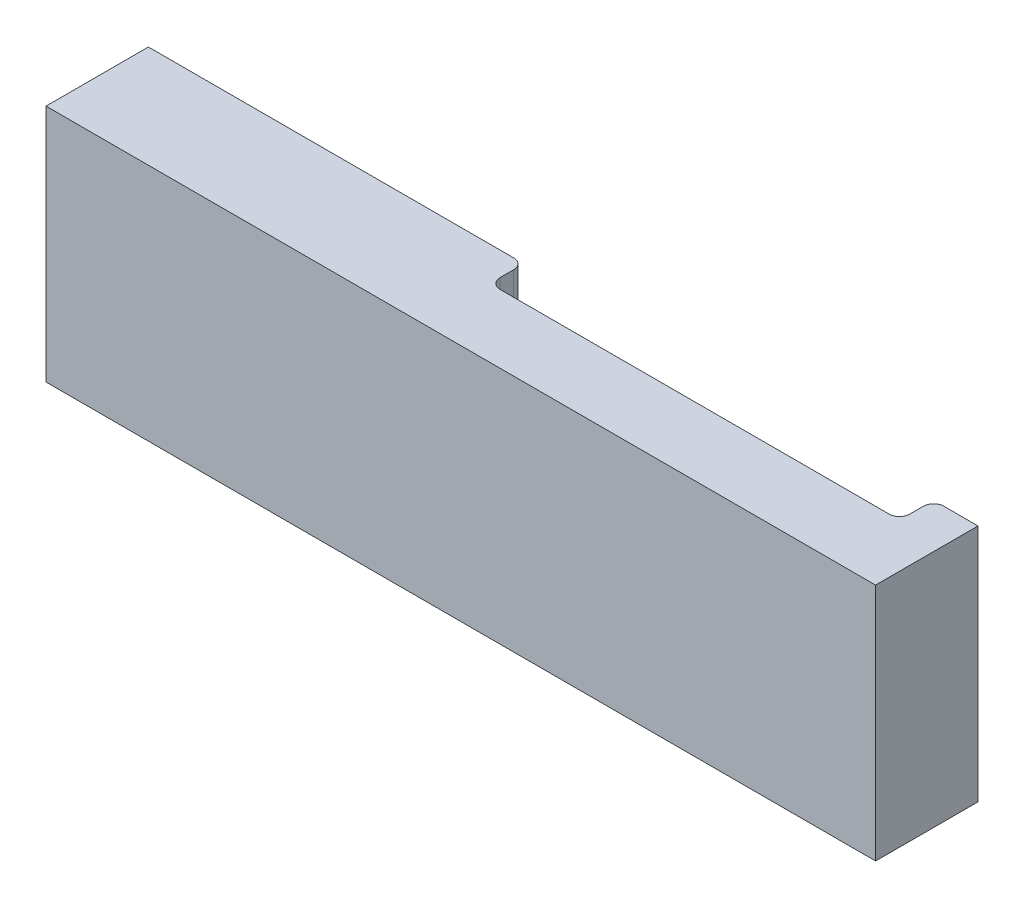
ISO-10303-21;
HEADER;
FILE_DESCRIPTION(('STEP AP214'),'2;1');
FILE_NAME('part.step','',(''),(''),'','','');
FILE_SCHEMA(('AUTOMOTIVE_DESIGN { 1 0 10303 214 1 1 1 1 }'));
ENDSEC;
DATA;
#1=APPLICATION_CONTEXT('core data for automotive mechanical design processes');
#2=APPLICATION_PROTOCOL_DEFINITION('international standard','automotive_design',2000,#1);
#3=PRODUCT_CONTEXT('',#1,'mechanical');
#4=PRODUCT('Part','Part','',(#3));
#5=PRODUCT_RELATED_PRODUCT_CATEGORY('part','',(#4));
#6=PRODUCT_DEFINITION_FORMATION('','',#4);
#7=PRODUCT_DEFINITION_CONTEXT('part definition',#1,'design');
#8=PRODUCT_DEFINITION('design','',#6,#7);
#9=PRODUCT_DEFINITION_SHAPE('','',#8);
#10=(LENGTH_UNIT() NAMED_UNIT(*) SI_UNIT(.MILLI.,.METRE.));
#11=(NAMED_UNIT(*) PLANE_ANGLE_UNIT() SI_UNIT($,.RADIAN.));
#12=(NAMED_UNIT(*) SI_UNIT($,.STERADIAN.) SOLID_ANGLE_UNIT());
#13=UNCERTAINTY_MEASURE_WITH_UNIT(LENGTH_MEASURE(1.E-05),#10,'distance_accuracy_value','');
#14=(GEOMETRIC_REPRESENTATION_CONTEXT(3) GLOBAL_UNCERTAINTY_ASSIGNED_CONTEXT((#13)) GLOBAL_UNIT_ASSIGNED_CONTEXT((#10,
#11,#12)) REPRESENTATION_CONTEXT('',''));
#15=CARTESIAN_POINT('',(0.,0.,0.));
#16=DIRECTION('',(0.,0.,1.));
#17=DIRECTION('',(1.,0.,0.));
#18=AXIS2_PLACEMENT_3D('',#15,#16,#17);
#19=CARTESIAN_POINT('',(-215.928984733419,70.,-7.06317118086571));
#20=DIRECTION('',(0.,0.,1.));
#21=DIRECTION('',(1.,0.,0.));
#22=AXIS2_PLACEMENT_3D('',#19,#20,#21);
#23=PLANE('',#22);
#24=DIRECTION('',(-1.,0.,0.));
#25=VECTOR('',#24,1.);
#26=CARTESIAN_POINT('',(-215.928984733419,0.,-7.06317118086571));
#27=LINE('',#26,#25);
#28=CARTESIAN_POINT('',(27.0710152665809,0.,-7.06317118086571));
#29=VERTEX_POINT('',#28);
#30=CARTESIAN_POINT('',(17.0710152665809,0.,-7.06317118086571));
#31=VERTEX_POINT('',#30);
#32=EDGE_CURVE('E144',#29,#31,#27,.T.);
#33=ORIENTED_EDGE('',*,*,#32,.T.);
#34=DIRECTION('',(0.,1.,0.));
#35=VECTOR('',#34,1.);
#36=CARTESIAN_POINT('',(17.0710152665809,70.,-7.06317118086571));
#37=LINE('',#36,#35);
#38=CARTESIAN_POINT('',(17.0710152665809,70.,-7.06317118086571));
#39=VERTEX_POINT('',#38);
#40=EDGE_CURVE('E149',#31,#39,#37,.T.);
#41=ORIENTED_EDGE('',*,*,#40,.T.);
#42=DIRECTION('',(-1.,0.,0.));
#43=VECTOR('',#42,1.);
#44=CARTESIAN_POINT('',(-215.928984733419,70.,-7.06317118086571));
#45=LINE('',#44,#43);
#46=CARTESIAN_POINT('',(27.0710152665809,70.,-7.06317118086571));
#47=VERTEX_POINT('',#46);
#48=EDGE_CURVE('E217',#47,#39,#45,.T.);
#49=ORIENTED_EDGE('',*,*,#48,.F.);
#50=DIRECTION('',(0.,-1.,0.));
#51=VECTOR('',#50,1.);
#52=CARTESIAN_POINT('',(27.0710152665809,70.,-7.06317118086571));
#53=LINE('',#52,#51);
#54=EDGE_CURVE('E154',#47,#29,#53,.T.);
#55=ORIENTED_EDGE('',*,*,#54,.T.);
#56=EDGE_LOOP('',(#33,#41,#49,#55));
#57=FACE_BOUND('',#56,.T.);
#58=ADVANCED_FACE('F33',(#57),#23,.F.);
#59=CARTESIAN_POINT('',(-215.928984733419,70.,-7.06317118086571));
#60=DIRECTION('',(1.,0.,0.));
#61=DIRECTION('',(0.,0.,-1.));
#62=AXIS2_PLACEMENT_3D('',#59,#60,#61);
#63=PLANE('',#62);
#64=DIRECTION('',(0.,0.,1.));
#65=VECTOR('',#64,1.);
#66=CARTESIAN_POINT('',(-215.928984733419,0.,-7.06317118086571));
#67=LINE('',#66,#65);
#68=CARTESIAN_POINT('',(-215.928984733419,0.,-7.06317118086571));
#69=VERTEX_POINT('',#68);
#70=CARTESIAN_POINT('',(-215.928984733419,0.,22.9368288191343));
#71=VERTEX_POINT('',#70);
#72=EDGE_CURVE('E148',#69,#71,#67,.T.);
#73=ORIENTED_EDGE('',*,*,#72,.T.);
#74=DIRECTION('',(0.,-1.,0.));
#75=VECTOR('',#74,1.);
#76=CARTESIAN_POINT('',(-215.928984733419,70.,22.9368288191343));
#77=LINE('',#76,#75);
#78=CARTESIAN_POINT('',(-215.928984733419,70.,22.9368288191343));
#79=VERTEX_POINT('',#78);
#80=EDGE_CURVE('E127',#79,#71,#77,.T.);
#81=ORIENTED_EDGE('',*,*,#80,.F.);
#82=DIRECTION('',(0.,0.,1.));
#83=VECTOR('',#82,1.);
#84=CARTESIAN_POINT('',(-215.928984733419,70.,-7.06317118086571));
#85=LINE('',#84,#83);
#86=CARTESIAN_POINT('',(-215.928984733419,70.,-7.06317118086571));
#87=VERTEX_POINT('',#86);
#88=EDGE_CURVE('E134',#87,#79,#85,.T.);
#89=ORIENTED_EDGE('',*,*,#88,.F.);
#90=DIRECTION('',(0.,-1.,0.));
#91=VECTOR('',#90,1.);
#92=CARTESIAN_POINT('',(-215.928984733419,70.,-7.06317118086571));
#93=LINE('',#92,#91);
#94=EDGE_CURVE('E218',#87,#69,#93,.T.);
#95=ORIENTED_EDGE('',*,*,#94,.T.);
#96=EDGE_LOOP('',(#73,#81,#89,#95));
#97=FACE_BOUND('',#96,.T.);
#98=ADVANCED_FACE('F146',(#97),#63,.F.);
#99=CARTESIAN_POINT('',(-215.928984733419,70.,22.9368288191343));
#100=DIRECTION('',(0.,0.,-1.));
#101=DIRECTION('',(-1.,0.,0.));
#102=AXIS2_PLACEMENT_3D('',#99,#100,#101);
#103=PLANE('',#102);
#104=DIRECTION('',(1.,0.,0.));
#105=VECTOR('',#104,1.);
#106=CARTESIAN_POINT('',(-215.928984733419,0.,22.9368288191343));
#107=LINE('',#106,#105);
#108=CARTESIAN_POINT('',(27.0710152665809,0.,22.9368288191343));
#109=VERTEX_POINT('',#108);
#110=EDGE_CURVE('E206',#71,#109,#107,.T.);
#111=ORIENTED_EDGE('',*,*,#110,.T.);
#112=DIRECTION('',(0.,-1.,0.));
#113=VECTOR('',#112,1.);
#114=CARTESIAN_POINT('',(27.0710152665809,70.,22.9368288191343));
#115=LINE('',#114,#113);
#116=CARTESIAN_POINT('',(27.0710152665809,70.,22.9368288191343));
#117=VERTEX_POINT('',#116);
#118=EDGE_CURVE('E130',#117,#109,#115,.T.);
#119=ORIENTED_EDGE('',*,*,#118,.F.);
#120=DIRECTION('',(1.,0.,0.));
#121=VECTOR('',#120,1.);
#122=CARTESIAN_POINT('',(-215.928984733419,70.,22.9368288191343));
#123=LINE('',#122,#121);
#124=EDGE_CURVE('E123',#79,#117,#123,.T.);
#125=ORIENTED_EDGE('',*,*,#124,.F.);
#126=ORIENTED_EDGE('',*,*,#80,.T.);
#127=EDGE_LOOP('',(#111,#119,#125,#126));
#128=FACE_BOUND('',#127,.T.);
#129=ADVANCED_FACE('F125',(#128),#103,.F.);
#130=CARTESIAN_POINT('',(27.0710152665809,70.,-7.06317118086571));
#131=DIRECTION('',(-1.,0.,0.));
#132=DIRECTION('',(0.,0.,1.));
#133=AXIS2_PLACEMENT_3D('',#130,#131,#132);
#134=PLANE('',#133);
#135=DIRECTION('',(0.,0.,-1.));
#136=VECTOR('',#135,1.);
#137=CARTESIAN_POINT('',(27.0710152665809,0.,-7.06317118086571));
#138=LINE('',#137,#136);
#139=EDGE_CURVE('E221',#109,#29,#138,.T.);
#140=ORIENTED_EDGE('',*,*,#139,.T.);
#141=ORIENTED_EDGE('',*,*,#54,.F.);
#142=DIRECTION('',(0.,0.,-1.));
#143=VECTOR('',#142,1.);
#144=CARTESIAN_POINT('',(27.0710152665809,70.,-7.06317118086571));
#145=LINE('',#144,#143);
#146=EDGE_CURVE('E133',#117,#47,#145,.T.);
#147=ORIENTED_EDGE('',*,*,#146,.F.);
#148=ORIENTED_EDGE('',*,*,#118,.T.);
#149=EDGE_LOOP('',(#140,#141,#147,#148));
#150=FACE_BOUND('',#149,.T.);
#151=ADVANCED_FACE('F240',(#150),#134,.F.);
#152=CARTESIAN_POINT('',(-108.928984733419,70.,-7.06317118086571));
#153=VERTEX_POINT('',#152);
#154=EDGE_CURVE('E140',#153,#87,#45,.T.);
#155=ORIENTED_EDGE('',*,*,#154,.F.);
#156=DIRECTION('',(0.,1.,0.));
#157=VECTOR('',#156,1.);
#158=CARTESIAN_POINT('',(-108.928984733419,70.,-7.06317118086571));
#159=LINE('',#158,#157);
#160=CARTESIAN_POINT('',(-108.928984733419,0.,-7.06317118086571));
#161=VERTEX_POINT('',#160);
#162=EDGE_CURVE('E178',#153,#161,#159,.F.);
#163=ORIENTED_EDGE('',*,*,#162,.T.);
#164=EDGE_CURVE('E223',#161,#69,#27,.T.);
#165=ORIENTED_EDGE('',*,*,#164,.T.);
#166=ORIENTED_EDGE('',*,*,#94,.F.);
#167=EDGE_LOOP('',(#155,#163,#165,#166));
#168=FACE_BOUND('',#167,.T.);
#169=ADVANCED_FACE('F242',(#168),#23,.F.);
#170=CARTESIAN_POINT('',(0.,70.,0.));
#171=DIRECTION('',(0.,1.,0.));
#172=DIRECTION('',(0.,0.,1.));
#173=AXIS2_PLACEMENT_3D('',#170,#171,#172);
#174=PLANE('',#173);
#175=ORIENTED_EDGE('',*,*,#48,.T.);
#176=CARTESIAN_POINT('',(17.0710152665809,70.,-4.06317118086571));
#177=DIRECTION('',(0.,1.,0.));
#178=DIRECTION('',(0.,0.,1.));
#179=AXIS2_PLACEMENT_3D('',#176,#177,#178);
#180=CIRCLE('',#179,3.);
#181=CARTESIAN_POINT('',(14.0710152665809,70.,-4.06317118086571));
#182=VERTEX_POINT('',#181);
#183=EDGE_CURVE('E159',#39,#182,#180,.T.);
#184=ORIENTED_EDGE('',*,*,#183,.T.);
#185=DIRECTION('',(0.,0.,-1.));
#186=VECTOR('',#185,1.);
#187=CARTESIAN_POINT('',(14.0710152665809,70.,2.93682881913429));
#188=LINE('',#187,#186);
#189=CARTESIAN_POINT('',(14.0710152665809,70.,-0.063171180865709));
#190=VERTEX_POINT('',#189);
#191=EDGE_CURVE('E192',#190,#182,#188,.T.);
#192=ORIENTED_EDGE('',*,*,#191,.F.);
#193=CARTESIAN_POINT('',(11.0710152665809,70.,-0.063171180865709));
#194=DIRECTION('',(0.,1.,0.));
#195=DIRECTION('',(0.,0.,1.));
#196=AXIS2_PLACEMENT_3D('',#193,#194,#195);
#197=CIRCLE('',#196,3.);
#198=CARTESIAN_POINT('',(11.0710152665809,70.,2.93682881913429));
#199=VERTEX_POINT('',#198);
#200=EDGE_CURVE('E180',#190,#199,#197,.F.);
#201=ORIENTED_EDGE('',*,*,#200,.T.);
#202=DIRECTION('',(1.,0.,0.));
#203=VECTOR('',#202,1.);
#204=CARTESIAN_POINT('',(14.0710152665809,70.,2.93682881913429));
#205=LINE('',#204,#203);
#206=CARTESIAN_POINT('',(-102.928984733419,70.,2.93682881913431));
#207=VERTEX_POINT('',#206);
#208=EDGE_CURVE('E187',#207,#199,#205,.T.);
#209=ORIENTED_EDGE('',*,*,#208,.F.);
#210=CARTESIAN_POINT('',(-102.928984733419,70.,-0.0631711808656942));
#211=DIRECTION('',(0.,1.,0.));
#212=DIRECTION('',(0.,0.,1.));
#213=AXIS2_PLACEMENT_3D('',#210,#211,#212);
#214=CIRCLE('',#213,3.);
#215=CARTESIAN_POINT('',(-105.928984733419,70.,-0.0631711808656943));
#216=VERTEX_POINT('',#215);
#217=EDGE_CURVE('E41',#207,#216,#214,.F.);
#218=ORIENTED_EDGE('',*,*,#217,.T.);
#219=DIRECTION('',(0.,0.,1.));
#220=VECTOR('',#219,1.);
#221=CARTESIAN_POINT('',(-105.928984733419,70.,2.93682881913431));
#222=LINE('',#221,#220);
#223=CARTESIAN_POINT('',(-105.928984733419,70.,-4.06317118086571));
#224=VERTEX_POINT('',#223);
#225=EDGE_CURVE('E185',#224,#216,#222,.T.);
#226=ORIENTED_EDGE('',*,*,#225,.F.);
#227=CARTESIAN_POINT('',(-108.928984733419,70.,-4.06317118086571));
#228=DIRECTION('',(0.,1.,0.));
#229=DIRECTION('',(0.,0.,1.));
#230=AXIS2_PLACEMENT_3D('',#227,#228,#229);
#231=CIRCLE('',#230,3.);
#232=EDGE_CURVE('E152',#224,#153,#231,.T.);
#233=ORIENTED_EDGE('',*,*,#232,.T.);
#234=ORIENTED_EDGE('',*,*,#154,.T.);
#235=ORIENTED_EDGE('',*,*,#88,.T.);
#236=ORIENTED_EDGE('',*,*,#124,.T.);
#237=ORIENTED_EDGE('',*,*,#146,.T.);
#238=EDGE_LOOP('',(#175,#184,#192,#201,#209,#218,#226,#233,#234,#235,#236,#237));
#239=FACE_BOUND('',#238,.T.);
#240=ADVANCED_FACE('F138',(#239),#174,.T.);
#241=CARTESIAN_POINT('',(0.,0.,0.));
#242=DIRECTION('',(0.,1.,0.));
#243=DIRECTION('',(0.,0.,1.));
#244=AXIS2_PLACEMENT_3D('',#241,#242,#243);
#245=PLANE('',#244);
#246=CARTESIAN_POINT('',(-51.2989847334191,0.,12.9368288191343));
#247=DIRECTION('',(0.,-1.,0.));
#248=DIRECTION('',(0.,0.,-1.));
#249=AXIS2_PLACEMENT_3D('',#246,#247,#248);
#250=CIRCLE('',#249,1.5);
#251=CARTESIAN_POINT('',(-51.2989847334191,0.,11.4368288191343));
#252=VERTEX_POINT('',#251);
#253=EDGE_CURVE('E289',#252,#252,#250,.T.);
#254=ORIENTED_EDGE('',*,*,#253,.F.);
#255=EDGE_LOOP('',(#254));
#256=FACE_BOUND('',#255,.T.);
#257=CARTESIAN_POINT('',(-185.928984733419,0.,2.93682881913429));
#258=DIRECTION('',(0.,-1.,0.));
#259=DIRECTION('',(0.,0.,-1.));
#260=AXIS2_PLACEMENT_3D('',#257,#258,#259);
#261=CIRCLE('',#260,1.5);
#262=CARTESIAN_POINT('',(-185.928984733419,0.,1.43682881913429));
#263=VERTEX_POINT('',#262);
#264=EDGE_CURVE('E297',#263,#263,#261,.T.);
#265=ORIENTED_EDGE('',*,*,#264,.F.);
#266=EDGE_LOOP('',(#265));
#267=FACE_BOUND('',#266,.T.);
#268=DIRECTION('',(0.,0.,-1.));
#269=VECTOR('',#268,1.);
#270=CARTESIAN_POINT('',(14.0710152665809,0.,2.93682881913429));
#271=LINE('',#270,#269);
#272=CARTESIAN_POINT('',(14.0710152665809,0.,-0.063171180865709));
#273=VERTEX_POINT('',#272);
#274=CARTESIAN_POINT('',(14.0710152665809,0.,-4.06317118086571));
#275=VERTEX_POINT('',#274);
#276=EDGE_CURVE('E208',#273,#275,#271,.T.);
#277=ORIENTED_EDGE('',*,*,#276,.T.);
#278=CARTESIAN_POINT('',(17.0710152665809,0.,-4.06317118086571));
#279=DIRECTION('',(0.,1.,0.));
#280=DIRECTION('',(0.,0.,1.));
#281=AXIS2_PLACEMENT_3D('',#278,#279,#280);
#282=CIRCLE('',#281,3.);
#283=EDGE_CURVE('E167',#275,#31,#282,.F.);
#284=ORIENTED_EDGE('',*,*,#283,.T.);
#285=ORIENTED_EDGE('',*,*,#32,.F.);
#286=ORIENTED_EDGE('',*,*,#139,.F.);
#287=ORIENTED_EDGE('',*,*,#110,.F.);
#288=ORIENTED_EDGE('',*,*,#72,.F.);
#289=ORIENTED_EDGE('',*,*,#164,.F.);
#290=CARTESIAN_POINT('',(-108.928984733419,0.,-4.06317118086571));
#291=DIRECTION('',(0.,1.,0.));
#292=DIRECTION('',(0.,0.,1.));
#293=AXIS2_PLACEMENT_3D('',#290,#291,#292);
#294=CIRCLE('',#293,3.);
#295=CARTESIAN_POINT('',(-105.928984733419,0.,-4.06317118086571));
#296=VERTEX_POINT('',#295);
#297=EDGE_CURVE('E55',#161,#296,#294,.F.);
#298=ORIENTED_EDGE('',*,*,#297,.T.);
#299=DIRECTION('',(0.,0.,1.));
#300=VECTOR('',#299,1.);
#301=CARTESIAN_POINT('',(-105.928984733419,0.,2.93682881913431));
#302=LINE('',#301,#300);
#303=CARTESIAN_POINT('',(-105.928984733419,0.,-0.0631711808656943));
#304=VERTEX_POINT('',#303);
#305=EDGE_CURVE('E201',#296,#304,#302,.T.);
#306=ORIENTED_EDGE('',*,*,#305,.T.);
#307=CARTESIAN_POINT('',(-102.928984733419,0.,-0.0631711808656942));
#308=DIRECTION('',(0.,1.,0.));
#309=DIRECTION('',(0.,0.,1.));
#310=AXIS2_PLACEMENT_3D('',#307,#308,#309);
#311=CIRCLE('',#310,3.);
#312=CARTESIAN_POINT('',(-102.928984733419,0.,2.93682881913431));
#313=VERTEX_POINT('',#312);
#314=EDGE_CURVE('E11',#304,#313,#311,.T.);
#315=ORIENTED_EDGE('',*,*,#314,.T.);
#316=DIRECTION('',(1.,0.,0.));
#317=VECTOR('',#316,1.);
#318=CARTESIAN_POINT('',(14.0710152665809,0.,2.93682881913429));
#319=LINE('',#318,#317);
#320=CARTESIAN_POINT('',(11.0710152665809,0.,2.93682881913429));
#321=VERTEX_POINT('',#320);
#322=EDGE_CURVE('E199',#313,#321,#319,.T.);
#323=ORIENTED_EDGE('',*,*,#322,.T.);
#324=CARTESIAN_POINT('',(11.0710152665809,0.,-0.063171180865709));
#325=DIRECTION('',(0.,1.,0.));
#326=DIRECTION('',(0.,0.,1.));
#327=AXIS2_PLACEMENT_3D('',#324,#325,#326);
#328=CIRCLE('',#327,3.);
#329=EDGE_CURVE('E182',#321,#273,#328,.T.);
#330=ORIENTED_EDGE('',*,*,#329,.T.);
#331=EDGE_LOOP('',(#277,#284,#285,#286,#287,#288,#289,#298,#306,#315,#323,#330));
#332=FACE_BOUND('',#331,.T.);
#333=ADVANCED_FACE('F198',(#256,#267,#332),#245,.F.);
#334=CARTESIAN_POINT('',(14.0710152665809,0.,2.93682881913429));
#335=DIRECTION('',(1.,0.,0.));
#336=DIRECTION('',(0.,0.,-1.));
#337=AXIS2_PLACEMENT_3D('',#334,#335,#336);
#338=PLANE('',#337);
#339=ORIENTED_EDGE('',*,*,#191,.T.);
#340=DIRECTION('',(0.,1.,0.));
#341=VECTOR('',#340,1.);
#342=CARTESIAN_POINT('',(14.0710152665809,0.,-4.06317118086571));
#343=LINE('',#342,#341);
#344=EDGE_CURVE('E164',#182,#275,#343,.F.);
#345=ORIENTED_EDGE('',*,*,#344,.T.);
#346=ORIENTED_EDGE('',*,*,#276,.F.);
#347=DIRECTION('',(0.,1.,0.));
#348=VECTOR('',#347,1.);
#349=CARTESIAN_POINT('',(14.0710152665809,70.,-0.063171180865709));
#350=LINE('',#349,#348);
#351=EDGE_CURVE('E161',#273,#190,#350,.T.);
#352=ORIENTED_EDGE('',*,*,#351,.T.);
#353=EDGE_LOOP('',(#339,#345,#346,#352));
#354=FACE_BOUND('',#353,.T.);
#355=ADVANCED_FACE('F259',(#354),#338,.F.);
#356=CARTESIAN_POINT('',(14.0710152665809,0.,2.93682881913429));
#357=DIRECTION('',(0.,0.,1.));
#358=DIRECTION('',(1.,0.,0.));
#359=AXIS2_PLACEMENT_3D('',#356,#357,#358);
#360=PLANE('',#359);
#361=ORIENTED_EDGE('',*,*,#208,.T.);
#362=DIRECTION('',(0.,1.,0.));
#363=VECTOR('',#362,1.);
#364=CARTESIAN_POINT('',(11.0710152665809,0.,2.93682881913429));
#365=LINE('',#364,#363);
#366=EDGE_CURVE('E172',#199,#321,#365,.F.);
#367=ORIENTED_EDGE('',*,*,#366,.T.);
#368=ORIENTED_EDGE('',*,*,#322,.F.);
#369=DIRECTION('',(0.,1.,0.));
#370=VECTOR('',#369,1.);
#371=CARTESIAN_POINT('',(-102.928984733419,70.,2.93682881913431));
#372=LINE('',#371,#370);
#373=EDGE_CURVE('E169',#313,#207,#372,.T.);
#374=ORIENTED_EDGE('',*,*,#373,.T.);
#375=EDGE_LOOP('',(#361,#367,#368,#374));
#376=FACE_BOUND('',#375,.T.);
#377=ADVANCED_FACE('F203',(#376),#360,.F.);
#378=CARTESIAN_POINT('',(-105.928984733419,0.,2.93682881913431));
#379=DIRECTION('',(-1.,0.,0.));
#380=DIRECTION('',(0.,0.,1.));
#381=AXIS2_PLACEMENT_3D('',#378,#379,#380);
#382=PLANE('',#381);
#383=ORIENTED_EDGE('',*,*,#305,.F.);
#384=DIRECTION('',(0.,1.,0.));
#385=VECTOR('',#384,1.);
#386=CARTESIAN_POINT('',(-105.928984733419,0.,-4.06317118086571));
#387=LINE('',#386,#385);
#388=EDGE_CURVE('E175',#296,#224,#387,.T.);
#389=ORIENTED_EDGE('',*,*,#388,.T.);
#390=ORIENTED_EDGE('',*,*,#225,.T.);
#391=DIRECTION('',(0.,1.,0.));
#392=VECTOR('',#391,1.);
#393=CARTESIAN_POINT('',(-105.928984733419,0.,-0.0631711808656942));
#394=LINE('',#393,#392);
#395=EDGE_CURVE('E48',#216,#304,#394,.F.);
#396=ORIENTED_EDGE('',*,*,#395,.T.);
#397=EDGE_LOOP('',(#383,#389,#390,#396));
#398=FACE_BOUND('',#397,.T.);
#399=ADVANCED_FACE('F190',(#398),#382,.F.);
#400=CARTESIAN_POINT('',(17.0710152665809,70.,-4.06317118086571));
#401=DIRECTION('',(0.,1.,0.));
#402=DIRECTION('',(0.,0.,1.));
#403=AXIS2_PLACEMENT_3D('',#400,#401,#402);
#404=CYLINDRICAL_SURFACE('',#403,3.);
#405=ORIENTED_EDGE('',*,*,#283,.F.);
#406=ORIENTED_EDGE('',*,*,#344,.F.);
#407=ORIENTED_EDGE('',*,*,#183,.F.);
#408=ORIENTED_EDGE('',*,*,#40,.F.);
#409=EDGE_LOOP('',(#405,#406,#407,#408));
#410=FACE_BOUND('',#409,.T.);
#411=ADVANCED_FACE('F238',(#410),#404,.T.);
#412=CARTESIAN_POINT('',(11.0710152665809,0.,-0.063171180865709));
#413=DIRECTION('',(0.,-1.,0.));
#414=DIRECTION('',(0.,0.,-1.));
#415=AXIS2_PLACEMENT_3D('',#412,#413,#414);
#416=CYLINDRICAL_SURFACE('',#415,3.);
#417=ORIENTED_EDGE('',*,*,#329,.F.);
#418=ORIENTED_EDGE('',*,*,#366,.F.);
#419=ORIENTED_EDGE('',*,*,#200,.F.);
#420=ORIENTED_EDGE('',*,*,#351,.F.);
#421=EDGE_LOOP('',(#417,#418,#419,#420));
#422=FACE_BOUND('',#421,.T.);
#423=ADVANCED_FACE('F333',(#422),#416,.F.);
#424=CARTESIAN_POINT('',(-108.928984733419,0.,-4.06317118086571));
#425=DIRECTION('',(0.,1.,0.));
#426=DIRECTION('',(0.,0.,1.));
#427=AXIS2_PLACEMENT_3D('',#424,#425,#426);
#428=CYLINDRICAL_SURFACE('',#427,3.);
#429=ORIENTED_EDGE('',*,*,#297,.F.);
#430=ORIENTED_EDGE('',*,*,#162,.F.);
#431=ORIENTED_EDGE('',*,*,#232,.F.);
#432=ORIENTED_EDGE('',*,*,#388,.F.);
#433=EDGE_LOOP('',(#429,#430,#431,#432));
#434=FACE_BOUND('',#433,.T.);
#435=ADVANCED_FACE('F327',(#434),#428,.T.);
#436=CARTESIAN_POINT('',(-102.928984733419,0.,-0.0631711808656942));
#437=DIRECTION('',(0.,-1.,0.));
#438=DIRECTION('',(0.,0.,-1.));
#439=AXIS2_PLACEMENT_3D('',#436,#437,#438);
#440=CYLINDRICAL_SURFACE('',#439,3.);
#441=ORIENTED_EDGE('',*,*,#314,.F.);
#442=ORIENTED_EDGE('',*,*,#395,.F.);
#443=ORIENTED_EDGE('',*,*,#217,.F.);
#444=ORIENTED_EDGE('',*,*,#373,.F.);
#445=EDGE_LOOP('',(#441,#442,#443,#444));
#446=FACE_BOUND('',#445,.T.);
#447=ADVANCED_FACE('F35',(#446),#440,.F.);
#448=CARTESIAN_POINT('',(-185.928984733419,20.,2.93682881913429));
#449=DIRECTION('',(0.,-1.,0.));
#450=DIRECTION('',(0.,0.,-1.));
#451=AXIS2_PLACEMENT_3D('',#448,#449,#450);
#452=CYLINDRICAL_SURFACE('',#451,1.5);
#453=CARTESIAN_POINT('',(-185.928984733419,20.,2.93682881913429));
#454=DIRECTION('',(0.,-1.,0.));
#455=DIRECTION('',(0.,0.,-1.));
#456=AXIS2_PLACEMENT_3D('',#453,#454,#455);
#457=CIRCLE('',#456,1.5);
#458=CARTESIAN_POINT('',(-185.928984733419,20.,1.43682881913429));
#459=VERTEX_POINT('',#458);
#460=EDGE_CURVE('E292',#459,#459,#457,.T.);
#461=ORIENTED_EDGE('',*,*,#460,.F.);
#462=EDGE_LOOP('',(#461));
#463=FACE_BOUND('',#462,.T.);
#464=ORIENTED_EDGE('',*,*,#264,.T.);
#465=EDGE_LOOP('',(#464));
#466=FACE_BOUND('',#465,.T.);
#467=ADVANCED_FACE('F270',(#463,#466),#452,.F.);
#468=CARTESIAN_POINT('',(-185.928984733419,20.,2.93682881913429));
#469=DIRECTION('',(0.,-1.,0.));
#470=DIRECTION('',(0.,0.,-1.));
#471=AXIS2_PLACEMENT_3D('',#468,#469,#470);
#472=PLANE('',#471);
#473=ORIENTED_EDGE('',*,*,#460,.T.);
#474=EDGE_LOOP('',(#473));
#475=FACE_BOUND('',#474,.T.);
#476=ADVANCED_FACE('F273',(#475),#472,.T.);
#477=CARTESIAN_POINT('',(-51.2989847334191,20.,12.9368288191343));
#478=DIRECTION('',(0.,-1.,0.));
#479=DIRECTION('',(0.,0.,-1.));
#480=AXIS2_PLACEMENT_3D('',#477,#478,#479);
#481=CYLINDRICAL_SURFACE('',#480,1.5);
#482=CARTESIAN_POINT('',(-51.2989847334191,20.,12.9368288191343));
#483=DIRECTION('',(0.,-1.,0.));
#484=DIRECTION('',(0.,0.,-1.));
#485=AXIS2_PLACEMENT_3D('',#482,#483,#484);
#486=CIRCLE('',#485,1.5);
#487=CARTESIAN_POINT('',(-51.2989847334191,20.,11.4368288191343));
#488=VERTEX_POINT('',#487);
#489=EDGE_CURVE('E213',#488,#488,#486,.T.);
#490=ORIENTED_EDGE('',*,*,#489,.F.);
#491=EDGE_LOOP('',(#490));
#492=FACE_BOUND('',#491,.T.);
#493=ORIENTED_EDGE('',*,*,#253,.T.);
#494=EDGE_LOOP('',(#493));
#495=FACE_BOUND('',#494,.T.);
#496=ADVANCED_FACE('F277',(#492,#495),#481,.F.);
#497=CARTESIAN_POINT('',(-51.2989847334191,20.,12.9368288191343));
#498=DIRECTION('',(0.,-1.,0.));
#499=DIRECTION('',(0.,0.,-1.));
#500=AXIS2_PLACEMENT_3D('',#497,#498,#499);
#501=PLANE('',#500);
#502=ORIENTED_EDGE('',*,*,#489,.T.);
#503=EDGE_LOOP('',(#502));
#504=FACE_BOUND('',#503,.T.);
#505=ADVANCED_FACE('F281',(#504),#501,.T.);
#506=CLOSED_SHELL('',(#58,#98,#129,#151,#169,#240,#333,#355,#377,#399,#411,#423,#435,#447,#467,
#476,#496,#505));
#507=MANIFOLD_SOLID_BREP('B2',#506);
#508=ADVANCED_BREP_SHAPE_REPRESENTATION('',(#18,#507),#14);
#509=SHAPE_DEFINITION_REPRESENTATION(#9,#508);
ENDSEC;
END-ISO-10303-21;
